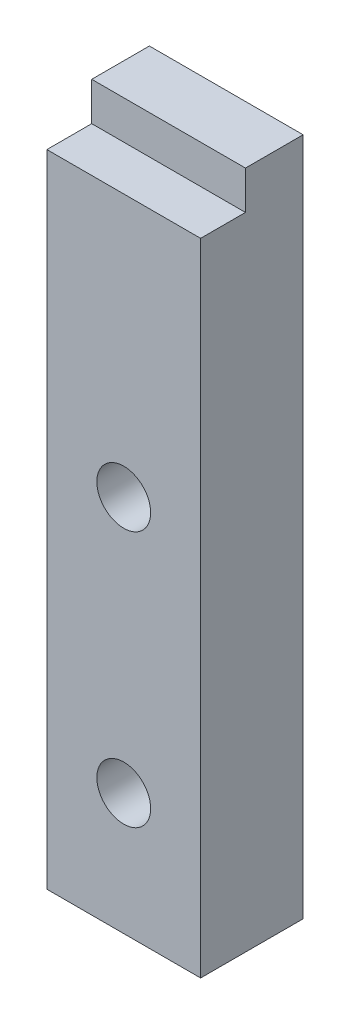
ISO-10303-21;
HEADER;
FILE_DESCRIPTION(('STEP AP214'),'2;1');
FILE_NAME('part.step','',(''),(''),'','','');
FILE_SCHEMA(('AUTOMOTIVE_DESIGN { 1 0 10303 214 1 1 1 1 }'));
ENDSEC;
DATA;
#1=APPLICATION_CONTEXT('core data for automotive mechanical design processes');
#2=APPLICATION_PROTOCOL_DEFINITION('international standard','automotive_design',2000,#1);
#3=PRODUCT_CONTEXT('',#1,'mechanical');
#4=PRODUCT('Part','Part','',(#3));
#5=PRODUCT_RELATED_PRODUCT_CATEGORY('part','',(#4));
#6=PRODUCT_DEFINITION_FORMATION('','',#4);
#7=PRODUCT_DEFINITION_CONTEXT('part definition',#1,'design');
#8=PRODUCT_DEFINITION('design','',#6,#7);
#9=PRODUCT_DEFINITION_SHAPE('','',#8);
#10=(LENGTH_UNIT() NAMED_UNIT(*) SI_UNIT(.MILLI.,.METRE.));
#11=(NAMED_UNIT(*) PLANE_ANGLE_UNIT() SI_UNIT($,.RADIAN.));
#12=(NAMED_UNIT(*) SI_UNIT($,.STERADIAN.) SOLID_ANGLE_UNIT());
#13=UNCERTAINTY_MEASURE_WITH_UNIT(LENGTH_MEASURE(1.E-05),#10,'distance_accuracy_value','');
#14=(GEOMETRIC_REPRESENTATION_CONTEXT(3) GLOBAL_UNCERTAINTY_ASSIGNED_CONTEXT((#13)) GLOBAL_UNIT_ASSIGNED_CONTEXT((#10,
#11,#12)) REPRESENTATION_CONTEXT('',''));
#15=CARTESIAN_POINT('',(0.,0.,0.));
#16=DIRECTION('',(0.,0.,1.));
#17=DIRECTION('',(1.,0.,0.));
#18=AXIS2_PLACEMENT_3D('',#15,#16,#17);
#19=CARTESIAN_POINT('',(0.,50.,8.));
#20=DIRECTION('',(0.,-1.,0.));
#21=DIRECTION('',(0.,0.,-1.));
#22=AXIS2_PLACEMENT_3D('',#19,#20,#21);
#23=PLANE('',#22);
#24=DIRECTION('',(1.,0.,0.));
#25=VECTOR('',#24,1.);
#26=CARTESIAN_POINT('',(0.,50.,4.5));
#27=LINE('',#26,#25);
#28=CARTESIAN_POINT('',(0.,50.,4.5));
#29=VERTEX_POINT('',#28);
#30=CARTESIAN_POINT('',(12.,50.,4.5));
#31=VERTEX_POINT('',#30);
#32=EDGE_CURVE('E48',#29,#31,#27,.T.);
#33=ORIENTED_EDGE('',*,*,#32,.F.);
#34=DIRECTION('',(0.,0.,-1.));
#35=VECTOR('',#34,1.);
#36=CARTESIAN_POINT('',(0.,50.,8.));
#37=LINE('',#36,#35);
#38=CARTESIAN_POINT('',(0.,50.,8.));
#39=VERTEX_POINT('',#38);
#40=EDGE_CURVE('E114',#39,#29,#37,.T.);
#41=ORIENTED_EDGE('',*,*,#40,.F.);
#42=DIRECTION('',(-1.,0.,0.));
#43=VECTOR('',#42,1.);
#44=CARTESIAN_POINT('',(0.,50.,8.));
#45=LINE('',#44,#43);
#46=CARTESIAN_POINT('',(12.,50.,8.));
#47=VERTEX_POINT('',#46);
#48=EDGE_CURVE('E57',#47,#39,#45,.T.);
#49=ORIENTED_EDGE('',*,*,#48,.F.);
#50=DIRECTION('',(0.,0.,-1.));
#51=VECTOR('',#50,1.);
#52=CARTESIAN_POINT('',(12.,50.,8.));
#53=LINE('',#52,#51);
#54=EDGE_CURVE('E143',#47,#31,#53,.T.);
#55=ORIENTED_EDGE('',*,*,#54,.T.);
#56=EDGE_LOOP('',(#33,#41,#49,#55));
#57=FACE_BOUND('',#56,.T.);
#58=ADVANCED_FACE('F33',(#57),#23,.F.);
#59=CARTESIAN_POINT('',(0.,0.,8.));
#60=DIRECTION('',(0.,0.,-1.));
#61=DIRECTION('',(-1.,0.,0.));
#62=AXIS2_PLACEMENT_3D('',#59,#60,#61);
#63=PLANE('',#62);
#64=DIRECTION('',(0.,-1.,0.));
#65=VECTOR('',#64,1.);
#66=CARTESIAN_POINT('',(0.,0.,8.));
#67=LINE('',#66,#65);
#68=CARTESIAN_POINT('',(0.,0.,8.));
#69=VERTEX_POINT('',#68);
#70=EDGE_CURVE('E132',#39,#69,#67,.T.);
#71=ORIENTED_EDGE('',*,*,#70,.T.);
#72=DIRECTION('',(1.,0.,0.));
#73=VECTOR('',#72,1.);
#74=CARTESIAN_POINT('',(0.,0.,8.));
#75=LINE('',#74,#73);
#76=CARTESIAN_POINT('',(12.,0.,8.));
#77=VERTEX_POINT('',#76);
#78=EDGE_CURVE('E75',#69,#77,#75,.T.);
#79=ORIENTED_EDGE('',*,*,#78,.T.);
#80=DIRECTION('',(0.,1.,0.));
#81=VECTOR('',#80,1.);
#82=CARTESIAN_POINT('',(12.,0.,8.));
#83=LINE('',#82,#81);
#84=EDGE_CURVE('E136',#77,#47,#83,.T.);
#85=ORIENTED_EDGE('',*,*,#84,.T.);
#86=ORIENTED_EDGE('',*,*,#48,.T.);
#87=EDGE_LOOP('',(#71,#79,#85,#86));
#88=FACE_BOUND('',#87,.T.);
#89=CARTESIAN_POINT('',(6.,29.5,8.));
#90=DIRECTION('',(0.,0.,1.));
#91=DIRECTION('',(1.,0.,0.));
#92=AXIS2_PLACEMENT_3D('',#89,#90,#91);
#93=CIRCLE('',#92,2.1);
#94=CARTESIAN_POINT('',(8.1,29.5,8.));
#95=VERTEX_POINT('',#94);
#96=EDGE_CURVE('E126',#95,#95,#93,.T.);
#97=ORIENTED_EDGE('',*,*,#96,.F.);
#98=EDGE_LOOP('',(#97));
#99=FACE_BOUND('',#98,.T.);
#100=CARTESIAN_POINT('',(6.,9.5,8.));
#101=DIRECTION('',(0.,0.,1.));
#102=DIRECTION('',(1.,0.,0.));
#103=AXIS2_PLACEMENT_3D('',#100,#101,#102);
#104=CIRCLE('',#103,2.1);
#105=CARTESIAN_POINT('',(8.1,9.5,8.));
#106=VERTEX_POINT('',#105);
#107=EDGE_CURVE('E118',#106,#106,#104,.T.);
#108=ORIENTED_EDGE('',*,*,#107,.F.);
#109=EDGE_LOOP('',(#108));
#110=FACE_BOUND('',#109,.T.);
#111=ADVANCED_FACE('F155',(#88,#99,#110),#63,.F.);
#112=CARTESIAN_POINT('',(0.,0.,0.));
#113=DIRECTION('',(0.,0.,-1.));
#114=DIRECTION('',(-1.,0.,0.));
#115=AXIS2_PLACEMENT_3D('',#112,#113,#114);
#116=PLANE('',#115);
#117=CARTESIAN_POINT('',(6.,29.5,0.));
#118=DIRECTION('',(0.,0.,1.));
#119=DIRECTION('',(1.,0.,0.));
#120=AXIS2_PLACEMENT_3D('',#117,#118,#119);
#121=CIRCLE('',#120,2.1);
#122=CARTESIAN_POINT('',(8.1,29.5,0.));
#123=VERTEX_POINT('',#122);
#124=EDGE_CURVE('E124',#123,#123,#121,.T.);
#125=ORIENTED_EDGE('',*,*,#124,.T.);
#126=EDGE_LOOP('',(#125));
#127=FACE_BOUND('',#126,.T.);
#128=DIRECTION('',(0.,-1.,0.));
#129=VECTOR('',#128,1.);
#130=CARTESIAN_POINT('',(0.,0.,0.));
#131=LINE('',#130,#129);
#132=CARTESIAN_POINT('',(0.,53.,0.));
#133=VERTEX_POINT('',#132);
#134=CARTESIAN_POINT('',(0.,0.,0.));
#135=VERTEX_POINT('',#134);
#136=EDGE_CURVE('E129',#133,#135,#131,.T.);
#137=ORIENTED_EDGE('',*,*,#136,.F.);
#138=DIRECTION('',(-1.,0.,0.));
#139=VECTOR('',#138,1.);
#140=CARTESIAN_POINT('',(0.,53.,0.));
#141=LINE('',#140,#139);
#142=CARTESIAN_POINT('',(12.,53.,0.));
#143=VERTEX_POINT('',#142);
#144=EDGE_CURVE('E109',#143,#133,#141,.T.);
#145=ORIENTED_EDGE('',*,*,#144,.F.);
#146=DIRECTION('',(0.,1.,0.));
#147=VECTOR('',#146,1.);
#148=CARTESIAN_POINT('',(12.,0.,0.));
#149=LINE('',#148,#147);
#150=CARTESIAN_POINT('',(12.,0.,0.));
#151=VERTEX_POINT('',#150);
#152=EDGE_CURVE('E134',#151,#143,#149,.T.);
#153=ORIENTED_EDGE('',*,*,#152,.F.);
#154=DIRECTION('',(1.,0.,0.));
#155=VECTOR('',#154,1.);
#156=CARTESIAN_POINT('',(0.,0.,0.));
#157=LINE('',#156,#155);
#158=EDGE_CURVE('E70',#135,#151,#157,.T.);
#159=ORIENTED_EDGE('',*,*,#158,.F.);
#160=EDGE_LOOP('',(#137,#145,#153,#159));
#161=FACE_BOUND('',#160,.T.);
#162=CARTESIAN_POINT('',(6.,9.5,0.));
#163=DIRECTION('',(0.,0.,1.));
#164=DIRECTION('',(1.,0.,0.));
#165=AXIS2_PLACEMENT_3D('',#162,#163,#164);
#166=CIRCLE('',#165,2.1);
#167=CARTESIAN_POINT('',(8.1,9.5,0.));
#168=VERTEX_POINT('',#167);
#169=EDGE_CURVE('E115',#168,#168,#166,.T.);
#170=ORIENTED_EDGE('',*,*,#169,.T.);
#171=EDGE_LOOP('',(#170));
#172=FACE_BOUND('',#171,.T.);
#173=ADVANCED_FACE('F150',(#127,#161,#172),#116,.T.);
#174=CARTESIAN_POINT('',(0.,0.,8.));
#175=DIRECTION('',(1.,0.,0.));
#176=DIRECTION('',(0.,0.,-1.));
#177=AXIS2_PLACEMENT_3D('',#174,#175,#176);
#178=PLANE('',#177);
#179=ORIENTED_EDGE('',*,*,#136,.T.);
#180=DIRECTION('',(0.,0.,-1.));
#181=VECTOR('',#180,1.);
#182=CARTESIAN_POINT('',(0.,0.,8.));
#183=LINE('',#182,#181);
#184=EDGE_CURVE('E11',#69,#135,#183,.T.);
#185=ORIENTED_EDGE('',*,*,#184,.F.);
#186=ORIENTED_EDGE('',*,*,#70,.F.);
#187=ORIENTED_EDGE('',*,*,#40,.T.);
#188=DIRECTION('',(0.,-1.,0.));
#189=VECTOR('',#188,1.);
#190=CARTESIAN_POINT('',(0.,53.,4.5));
#191=LINE('',#190,#189);
#192=CARTESIAN_POINT('',(0.,53.,4.5));
#193=VERTEX_POINT('',#192);
#194=EDGE_CURVE('E96',#193,#29,#191,.T.);
#195=ORIENTED_EDGE('',*,*,#194,.F.);
#196=DIRECTION('',(0.,0.,1.));
#197=VECTOR('',#196,1.);
#198=CARTESIAN_POINT('',(0.,53.,0.));
#199=LINE('',#198,#197);
#200=EDGE_CURVE('E103',#133,#193,#199,.T.);
#201=ORIENTED_EDGE('',*,*,#200,.F.);
#202=EDGE_LOOP('',(#179,#185,#186,#187,#195,#201));
#203=FACE_BOUND('',#202,.T.);
#204=ADVANCED_FACE('F35',(#203),#178,.F.);
#205=CARTESIAN_POINT('',(0.,0.,8.));
#206=DIRECTION('',(0.,1.,0.));
#207=DIRECTION('',(0.,0.,1.));
#208=AXIS2_PLACEMENT_3D('',#205,#206,#207);
#209=PLANE('',#208);
#210=ORIENTED_EDGE('',*,*,#158,.T.);
#211=DIRECTION('',(0.,0.,-1.));
#212=VECTOR('',#211,1.);
#213=CARTESIAN_POINT('',(12.,0.,8.));
#214=LINE('',#213,#212);
#215=EDGE_CURVE('E41',#77,#151,#214,.T.);
#216=ORIENTED_EDGE('',*,*,#215,.F.);
#217=ORIENTED_EDGE('',*,*,#78,.F.);
#218=ORIENTED_EDGE('',*,*,#184,.T.);
#219=EDGE_LOOP('',(#210,#216,#217,#218));
#220=FACE_BOUND('',#219,.T.);
#221=ADVANCED_FACE('F175',(#220),#209,.F.);
#222=CARTESIAN_POINT('',(12.,0.,8.));
#223=DIRECTION('',(-1.,0.,0.));
#224=DIRECTION('',(0.,0.,1.));
#225=AXIS2_PLACEMENT_3D('',#222,#223,#224);
#226=PLANE('',#225);
#227=ORIENTED_EDGE('',*,*,#152,.T.);
#228=DIRECTION('',(0.,0.,-1.));
#229=VECTOR('',#228,1.);
#230=CARTESIAN_POINT('',(12.,53.,0.));
#231=LINE('',#230,#229);
#232=CARTESIAN_POINT('',(12.,53.,4.5));
#233=VERTEX_POINT('',#232);
#234=EDGE_CURVE('E102',#233,#143,#231,.T.);
#235=ORIENTED_EDGE('',*,*,#234,.F.);
#236=DIRECTION('',(0.,-1.,0.));
#237=VECTOR('',#236,1.);
#238=CARTESIAN_POINT('',(12.,53.,4.5));
#239=LINE('',#238,#237);
#240=EDGE_CURVE('E98',#233,#31,#239,.T.);
#241=ORIENTED_EDGE('',*,*,#240,.T.);
#242=ORIENTED_EDGE('',*,*,#54,.F.);
#243=ORIENTED_EDGE('',*,*,#84,.F.);
#244=ORIENTED_EDGE('',*,*,#215,.T.);
#245=EDGE_LOOP('',(#227,#235,#241,#242,#243,#244));
#246=FACE_BOUND('',#245,.T.);
#247=ADVANCED_FACE('F147',(#246),#226,.F.);
#248=CARTESIAN_POINT('',(6.,29.5,8.));
#249=DIRECTION('',(0.,0.,-1.));
#250=DIRECTION('',(-1.,0.,0.));
#251=AXIS2_PLACEMENT_3D('',#248,#249,#250);
#252=CYLINDRICAL_SURFACE('',#251,2.1);
#253=ORIENTED_EDGE('',*,*,#96,.T.);
#254=EDGE_LOOP('',(#253));
#255=FACE_BOUND('',#254,.T.);
#256=ORIENTED_EDGE('',*,*,#124,.F.);
#257=EDGE_LOOP('',(#256));
#258=FACE_BOUND('',#257,.T.);
#259=ADVANCED_FACE('F166',(#255,#258),#252,.F.);
#260=CARTESIAN_POINT('',(6.,9.5,8.));
#261=DIRECTION('',(0.,0.,-1.));
#262=DIRECTION('',(-1.,0.,0.));
#263=AXIS2_PLACEMENT_3D('',#260,#261,#262);
#264=CYLINDRICAL_SURFACE('',#263,2.1);
#265=ORIENTED_EDGE('',*,*,#107,.T.);
#266=EDGE_LOOP('',(#265));
#267=FACE_BOUND('',#266,.T.);
#268=ORIENTED_EDGE('',*,*,#169,.F.);
#269=EDGE_LOOP('',(#268));
#270=FACE_BOUND('',#269,.T.);
#271=ADVANCED_FACE('F163',(#267,#270),#264,.F.);
#272=CARTESIAN_POINT('',(0.,53.,4.5));
#273=DIRECTION('',(0.,0.,-1.));
#274=DIRECTION('',(-1.,0.,0.));
#275=AXIS2_PLACEMENT_3D('',#272,#273,#274);
#276=PLANE('',#275);
#277=ORIENTED_EDGE('',*,*,#32,.T.);
#278=ORIENTED_EDGE('',*,*,#240,.F.);
#279=DIRECTION('',(1.,0.,0.));
#280=VECTOR('',#279,1.);
#281=CARTESIAN_POINT('',(0.,53.,4.5));
#282=LINE('',#281,#280);
#283=EDGE_CURVE('E92',#193,#233,#282,.T.);
#284=ORIENTED_EDGE('',*,*,#283,.F.);
#285=ORIENTED_EDGE('',*,*,#194,.T.);
#286=EDGE_LOOP('',(#277,#278,#284,#285));
#287=FACE_BOUND('',#286,.T.);
#288=ADVANCED_FACE('F94',(#287),#276,.F.);
#289=CARTESIAN_POINT('',(0.,53.,0.));
#290=DIRECTION('',(0.,1.,0.));
#291=DIRECTION('',(0.,0.,1.));
#292=AXIS2_PLACEMENT_3D('',#289,#290,#291);
#293=PLANE('',#292);
#294=ORIENTED_EDGE('',*,*,#200,.T.);
#295=ORIENTED_EDGE('',*,*,#283,.T.);
#296=ORIENTED_EDGE('',*,*,#234,.T.);
#297=ORIENTED_EDGE('',*,*,#144,.T.);
#298=EDGE_LOOP('',(#294,#295,#296,#297));
#299=FACE_BOUND('',#298,.T.);
#300=ADVANCED_FACE('F107',(#299),#293,.T.);
#301=CLOSED_SHELL('',(#58,#111,#173,#204,#221,#247,#259,#271,#288,#300));
#302=MANIFOLD_SOLID_BREP('B2',#301);
#303=ADVANCED_BREP_SHAPE_REPRESENTATION('',(#18,#302),#14);
#304=SHAPE_DEFINITION_REPRESENTATION(#9,#303);
ENDSEC;
END-ISO-10303-21;
